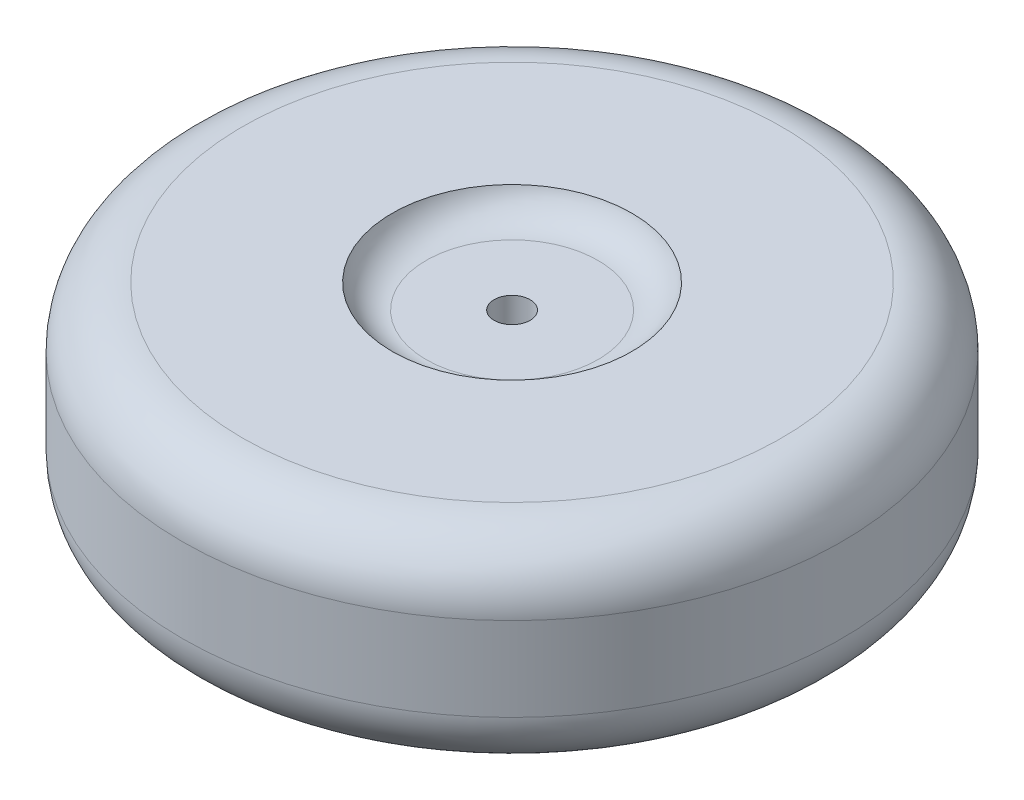
ISO-10303-21;
HEADER;
FILE_DESCRIPTION(('STEP AP214'),'2;1');
FILE_NAME('part.step','',(''),(''),'','','');
FILE_SCHEMA(('AUTOMOTIVE_DESIGN { 1 0 10303 214 1 1 1 1 }'));
ENDSEC;
DATA;
#1=APPLICATION_CONTEXT('core data for automotive mechanical design processes');
#2=APPLICATION_PROTOCOL_DEFINITION('international standard','automotive_design',2000,#1);
#3=PRODUCT_CONTEXT('',#1,'mechanical');
#4=PRODUCT('Part','Part','',(#3));
#5=PRODUCT_RELATED_PRODUCT_CATEGORY('part','',(#4));
#6=PRODUCT_DEFINITION_FORMATION('','',#4);
#7=PRODUCT_DEFINITION_CONTEXT('part definition',#1,'design');
#8=PRODUCT_DEFINITION('design','',#6,#7);
#9=PRODUCT_DEFINITION_SHAPE('','',#8);
#10=(LENGTH_UNIT() NAMED_UNIT(*) SI_UNIT(.MILLI.,.METRE.));
#11=(NAMED_UNIT(*) PLANE_ANGLE_UNIT() SI_UNIT($,.RADIAN.));
#12=(NAMED_UNIT(*) SI_UNIT($,.STERADIAN.) SOLID_ANGLE_UNIT());
#13=UNCERTAINTY_MEASURE_WITH_UNIT(LENGTH_MEASURE(1.E-05),#10,'distance_accuracy_value','');
#14=(GEOMETRIC_REPRESENTATION_CONTEXT(3) GLOBAL_UNCERTAINTY_ASSIGNED_CONTEXT((#13)) GLOBAL_UNIT_ASSIGNED_CONTEXT((#10,
#11,#12)) REPRESENTATION_CONTEXT('',''));
#15=CARTESIAN_POINT('',(0.,0.,0.));
#16=DIRECTION('',(0.,0.,1.));
#17=DIRECTION('',(1.,0.,0.));
#18=AXIS2_PLACEMENT_3D('',#15,#16,#17);
#19=CARTESIAN_POINT('',(0.,17.,0.));
#20=DIRECTION('',(0.,-1.,0.));
#21=DIRECTION('',(0.,0.,-1.));
#22=AXIS2_PLACEMENT_3D('',#19,#20,#21);
#23=CYLINDRICAL_SURFACE('',#22,1.5);
#24=CARTESIAN_POINT('',(0.,15.,0.));
#25=DIRECTION('',(0.,1.,0.));
#26=DIRECTION('',(0.,0.,1.));
#27=AXIS2_PLACEMENT_3D('',#24,#25,#26);
#28=CIRCLE('',#27,1.5);
#29=CARTESIAN_POINT('',(0.,15.,1.5));
#30=VERTEX_POINT('',#29);
#31=EDGE_CURVE('E76',#30,#30,#28,.F.);
#32=ORIENTED_EDGE('',*,*,#31,.F.);
#33=EDGE_LOOP('',(#32));
#34=FACE_BOUND('',#33,.T.);
#35=CARTESIAN_POINT('',(0.,2.,0.));
#36=DIRECTION('',(0.,-1.,0.));
#37=DIRECTION('',(0.,0.,-1.));
#38=AXIS2_PLACEMENT_3D('',#35,#36,#37);
#39=CIRCLE('',#38,1.5);
#40=CARTESIAN_POINT('',(0.,2.,-1.5));
#41=VERTEX_POINT('',#40);
#42=EDGE_CURVE('E70',#41,#41,#39,.F.);
#43=ORIENTED_EDGE('',*,*,#42,.F.);
#44=EDGE_LOOP('',(#43));
#45=FACE_BOUND('',#44,.T.);
#46=ADVANCED_FACE('F49',(#34,#45),#23,.F.);
#47=CARTESIAN_POINT('',(0.,17.,0.));
#48=DIRECTION('',(0.,-1.,0.));
#49=DIRECTION('',(0.,0.,-1.));
#50=AXIS2_PLACEMENT_3D('',#47,#48,#49);
#51=CYLINDRICAL_SURFACE('',#50,27.5);
#52=CARTESIAN_POINT('',(0.,12.,0.));
#53=DIRECTION('',(0.,1.,0.));
#54=DIRECTION('',(0.,0.,1.));
#55=AXIS2_PLACEMENT_3D('',#52,#53,#54);
#56=CIRCLE('',#55,27.5);
#57=CARTESIAN_POINT('',(0.,12.,27.5));
#58=VERTEX_POINT('',#57);
#59=EDGE_CURVE('E67',#58,#58,#56,.F.);
#60=ORIENTED_EDGE('',*,*,#59,.T.);
#61=EDGE_LOOP('',(#60));
#62=FACE_BOUND('',#61,.T.);
#63=CARTESIAN_POINT('',(0.,5.,0.));
#64=DIRECTION('',(0.,1.,0.));
#65=DIRECTION('',(0.,0.,1.));
#66=AXIS2_PLACEMENT_3D('',#63,#64,#65);
#67=CIRCLE('',#66,27.5);
#68=CARTESIAN_POINT('',(0.,5.,27.5));
#69=VERTEX_POINT('',#68);
#70=EDGE_CURVE('E84',#69,#69,#67,.T.);
#71=ORIENTED_EDGE('',*,*,#70,.T.);
#72=EDGE_LOOP('',(#71));
#73=FACE_BOUND('',#72,.T.);
#74=ADVANCED_FACE('F115',(#62,#73),#51,.T.);
#75=CARTESIAN_POINT('',(0.,17.,0.));
#76=DIRECTION('',(0.,1.,0.));
#77=DIRECTION('',(0.,0.,1.));
#78=AXIS2_PLACEMENT_3D('',#75,#76,#77);
#79=PLANE('',#78);
#80=CARTESIAN_POINT('',(0.,17.,0.));
#81=DIRECTION('',(0.,1.,0.));
#82=DIRECTION('',(0.,0.,1.));
#83=AXIS2_PLACEMENT_3D('',#80,#81,#82);
#84=CIRCLE('',#83,10.);
#85=CARTESIAN_POINT('',(0.,17.,10.));
#86=VERTEX_POINT('',#85);
#87=EDGE_CURVE('E74',#86,#86,#84,.T.);
#88=ORIENTED_EDGE('',*,*,#87,.F.);
#89=EDGE_LOOP('',(#88));
#90=FACE_BOUND('',#89,.T.);
#91=CARTESIAN_POINT('',(0.,17.,0.));
#92=DIRECTION('',(0.,1.,0.));
#93=DIRECTION('',(0.,0.,1.));
#94=AXIS2_PLACEMENT_3D('',#91,#92,#93);
#95=CIRCLE('',#94,22.5);
#96=CARTESIAN_POINT('',(0.,17.,22.5));
#97=VERTEX_POINT('',#96);
#98=EDGE_CURVE('E79',#97,#97,#95,.T.);
#99=ORIENTED_EDGE('',*,*,#98,.T.);
#100=EDGE_LOOP('',(#99));
#101=FACE_BOUND('',#100,.T.);
#102=ADVANCED_FACE('F104',(#90,#101),#79,.T.);
#103=CARTESIAN_POINT('',(0.,0.,0.));
#104=DIRECTION('',(0.,1.,0.));
#105=DIRECTION('',(0.,0.,1.));
#106=AXIS2_PLACEMENT_3D('',#103,#104,#105);
#107=PLANE('',#106);
#108=CARTESIAN_POINT('',(0.,0.,0.));
#109=DIRECTION('',(0.,-1.,0.));
#110=DIRECTION('',(0.,0.,-1.));
#111=AXIS2_PLACEMENT_3D('',#108,#109,#110);
#112=CIRCLE('',#111,10.);
#113=CARTESIAN_POINT('',(0.,0.,-10.));
#114=VERTEX_POINT('',#113);
#115=EDGE_CURVE('E75',#114,#114,#112,.T.);
#116=ORIENTED_EDGE('',*,*,#115,.F.);
#117=EDGE_LOOP('',(#116));
#118=FACE_BOUND('',#117,.T.);
#119=CARTESIAN_POINT('',(0.,0.,0.));
#120=DIRECTION('',(0.,1.,0.));
#121=DIRECTION('',(0.,0.,1.));
#122=AXIS2_PLACEMENT_3D('',#119,#120,#121);
#123=CIRCLE('',#122,22.5);
#124=CARTESIAN_POINT('',(0.,0.,22.5));
#125=VERTEX_POINT('',#124);
#126=EDGE_CURVE('E62',#125,#125,#123,.F.);
#127=ORIENTED_EDGE('',*,*,#126,.T.);
#128=EDGE_LOOP('',(#127));
#129=FACE_BOUND('',#128,.T.);
#130=ADVANCED_FACE('F100',(#118,#129),#107,.F.);
#131=CARTESIAN_POINT('',(0.,12.,0.));
#132=DIRECTION('',(0.,1.,0.));
#133=DIRECTION('',(0.,0.,1.));
#134=AXIS2_PLACEMENT_3D('',#131,#132,#133);
#135=TOROIDAL_SURFACE('',#134,22.5,5.);
#136=ORIENTED_EDGE('',*,*,#59,.F.);
#137=EDGE_LOOP('',(#136));
#138=FACE_BOUND('',#137,.T.);
#139=ORIENTED_EDGE('',*,*,#98,.F.);
#140=EDGE_LOOP('',(#139));
#141=FACE_BOUND('',#140,.T.);
#142=ADVANCED_FACE('F103',(#138,#141),#135,.T.);
#143=CARTESIAN_POINT('',(0.,5.,0.));
#144=DIRECTION('',(0.,1.,0.));
#145=DIRECTION('',(0.,0.,1.));
#146=AXIS2_PLACEMENT_3D('',#143,#144,#145);
#147=TOROIDAL_SURFACE('',#146,22.5,5.);
#148=ORIENTED_EDGE('',*,*,#126,.F.);
#149=EDGE_LOOP('',(#148));
#150=FACE_BOUND('',#149,.T.);
#151=ORIENTED_EDGE('',*,*,#70,.F.);
#152=EDGE_LOOP('',(#151));
#153=FACE_BOUND('',#152,.T.);
#154=ADVANCED_FACE('F108',(#150,#153),#147,.T.);
#155=CARTESIAN_POINT('',(0.,15.,0.));
#156=DIRECTION('',(0.,1.,0.));
#157=DIRECTION('',(0.,0.,1.));
#158=AXIS2_PLACEMENT_3D('',#155,#156,#157);
#159=PLANE('',#158);
#160=CARTESIAN_POINT('',(0.,15.,0.));
#161=DIRECTION('',(0.,1.,0.));
#162=DIRECTION('',(0.,0.,1.));
#163=AXIS2_PLACEMENT_3D('',#160,#161,#162);
#164=CIRCLE('',#163,7.17157287525381);
#165=CARTESIAN_POINT('',(0.,15.,7.17157287525381));
#166=VERTEX_POINT('',#165);
#167=EDGE_CURVE('E57',#166,#166,#164,.T.);
#168=ORIENTED_EDGE('',*,*,#167,.T.);
#169=EDGE_LOOP('',(#168));
#170=FACE_BOUND('',#169,.T.);
#171=ORIENTED_EDGE('',*,*,#31,.T.);
#172=EDGE_LOOP('',(#171));
#173=FACE_BOUND('',#172,.T.);
#174=ADVANCED_FACE('F111',(#170,#173),#159,.T.);
#175=CARTESIAN_POINT('',(0.,2.,0.));
#176=DIRECTION('',(0.,-1.,0.));
#177=DIRECTION('',(0.,0.,-1.));
#178=AXIS2_PLACEMENT_3D('',#175,#176,#177);
#179=PLANE('',#178);
#180=CARTESIAN_POINT('',(0.,2.,0.));
#181=DIRECTION('',(0.,-1.,0.));
#182=DIRECTION('',(0.,0.,-1.));
#183=AXIS2_PLACEMENT_3D('',#180,#181,#182);
#184=CIRCLE('',#183,7.17157287525381);
#185=CARTESIAN_POINT('',(0.,2.,-7.17157287525381));
#186=VERTEX_POINT('',#185);
#187=EDGE_CURVE('E10',#186,#186,#184,.T.);
#188=ORIENTED_EDGE('',*,*,#187,.T.);
#189=EDGE_LOOP('',(#188));
#190=FACE_BOUND('',#189,.T.);
#191=ORIENTED_EDGE('',*,*,#42,.T.);
#192=EDGE_LOOP('',(#191));
#193=FACE_BOUND('',#192,.T.);
#194=ADVANCED_FACE('F132',(#190,#193),#179,.T.);
#195=CARTESIAN_POINT('',(0.,18.,0.));
#196=DIRECTION('',(0.,-1.,0.));
#197=DIRECTION('',(0.,0.,-1.));
#198=AXIS2_PLACEMENT_3D('',#195,#196,#197);
#199=TOROIDAL_SURFACE('',#198,7.17157287525381,3.);
#200=ORIENTED_EDGE('',*,*,#87,.T.);
#201=EDGE_LOOP('',(#200));
#202=FACE_BOUND('',#201,.T.);
#203=ORIENTED_EDGE('',*,*,#167,.F.);
#204=EDGE_LOOP('',(#203));
#205=FACE_BOUND('',#204,.T.);
#206=ADVANCED_FACE('F130',(#202,#205),#199,.F.);
#207=CARTESIAN_POINT('',(0.,-1.,0.));
#208=DIRECTION('',(0.,1.,0.));
#209=DIRECTION('',(0.,0.,1.));
#210=AXIS2_PLACEMENT_3D('',#207,#208,#209);
#211=TOROIDAL_SURFACE('',#210,7.17157287525381,3.);
#212=ORIENTED_EDGE('',*,*,#115,.T.);
#213=EDGE_LOOP('',(#212));
#214=FACE_BOUND('',#213,.T.);
#215=ORIENTED_EDGE('',*,*,#187,.F.);
#216=EDGE_LOOP('',(#215));
#217=FACE_BOUND('',#216,.T.);
#218=ADVANCED_FACE('F51',(#214,#217),#211,.F.);
#219=CLOSED_SHELL('',(#46,#74,#102,#130,#142,#154,#174,#194,#206,#218));
#220=MANIFOLD_SOLID_BREP('B2',#219);
#221=ADVANCED_BREP_SHAPE_REPRESENTATION('',(#18,#220),#14);
#222=SHAPE_DEFINITION_REPRESENTATION(#9,#221);
ENDSEC;
END-ISO-10303-21;
